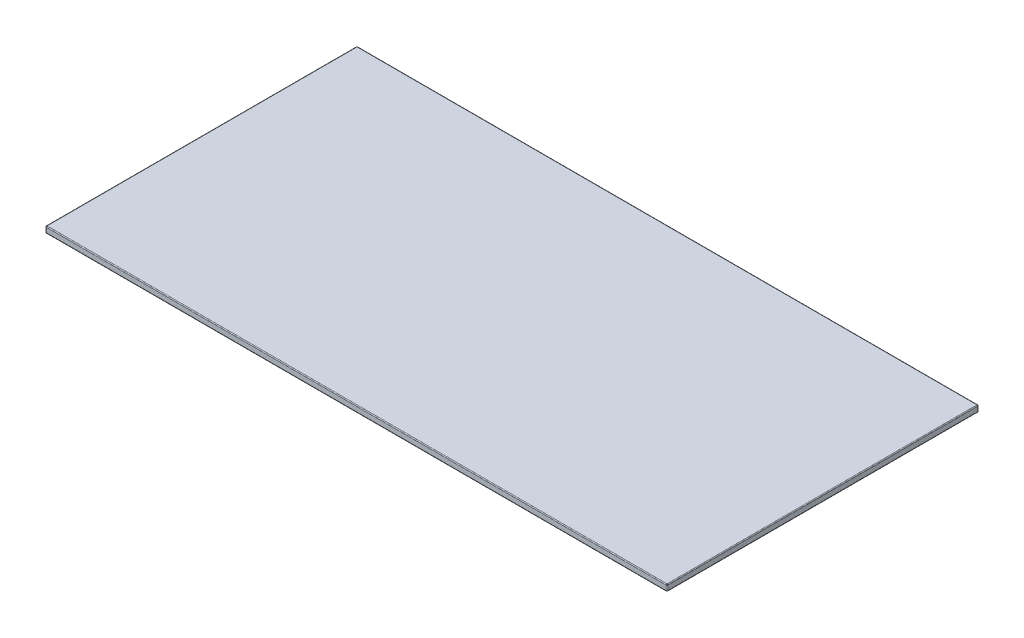
ISO-10303-21;
HEADER;
FILE_DESCRIPTION(('STEP AP214'),'2;1');
FILE_NAME('part.step','',(''),(''),'','','');
FILE_SCHEMA(('AUTOMOTIVE_DESIGN { 1 0 10303 214 1 1 1 1 }'));
ENDSEC;
DATA;
#1=APPLICATION_CONTEXT('core data for automotive mechanical design processes');
#2=APPLICATION_PROTOCOL_DEFINITION('international standard','automotive_design',2000,#1);
#3=PRODUCT_CONTEXT('',#1,'mechanical');
#4=PRODUCT('Part','Part','',(#3));
#5=PRODUCT_RELATED_PRODUCT_CATEGORY('part','',(#4));
#6=PRODUCT_DEFINITION_FORMATION('','',#4);
#7=PRODUCT_DEFINITION_CONTEXT('part definition',#1,'design');
#8=PRODUCT_DEFINITION('design','',#6,#7);
#9=PRODUCT_DEFINITION_SHAPE('','',#8);
#10=(LENGTH_UNIT() NAMED_UNIT(*) SI_UNIT(.MILLI.,.METRE.));
#11=(NAMED_UNIT(*) PLANE_ANGLE_UNIT() SI_UNIT($,.RADIAN.));
#12=(NAMED_UNIT(*) SI_UNIT($,.STERADIAN.) SOLID_ANGLE_UNIT());
#13=UNCERTAINTY_MEASURE_WITH_UNIT(LENGTH_MEASURE(1.E-05),#10,'distance_accuracy_value','');
#14=(GEOMETRIC_REPRESENTATION_CONTEXT(3) GLOBAL_UNCERTAINTY_ASSIGNED_CONTEXT((#13)) GLOBAL_UNIT_ASSIGNED_CONTEXT((#10,
#11,#12)) REPRESENTATION_CONTEXT('',''));
#15=CARTESIAN_POINT('',(0.,0.,0.));
#16=DIRECTION('',(0.,0.,1.));
#17=DIRECTION('',(1.,0.,0.));
#18=AXIS2_PLACEMENT_3D('',#15,#16,#17);
#19=CARTESIAN_POINT('',(-1018.38125,20.6375,510.38125));
#20=DIRECTION('',(1.,0.,0.));
#21=DIRECTION('',(0.,0.,-1.));
#22=AXIS2_PLACEMENT_3D('',#19,#20,#21);
#23=PLANE('',#22);
#24=DIRECTION('',(0.,0.,1.));
#25=VECTOR('',#24,1.);
#26=CARTESIAN_POINT('',(-1018.38125,2.54,510.38125));
#27=LINE('',#26,#25);
#28=CARTESIAN_POINT('',(-1018.38125,2.54,-507.84125));
#29=VERTEX_POINT('',#28);
#30=CARTESIAN_POINT('',(-1018.38125,2.54,507.84125));
#31=VERTEX_POINT('',#30);
#32=EDGE_CURVE('E194',#29,#31,#27,.T.);
#33=ORIENTED_EDGE('',*,*,#32,.T.);
#34=DIRECTION('',(0.,-1.,0.));
#35=VECTOR('',#34,1.);
#36=CARTESIAN_POINT('',(-1018.38125,20.6375,507.84125));
#37=LINE('',#36,#35);
#38=CARTESIAN_POINT('',(-1018.38125,18.0975,507.84125));
#39=VERTEX_POINT('',#38);
#40=EDGE_CURVE('E197',#31,#39,#37,.F.);
#41=ORIENTED_EDGE('',*,*,#40,.T.);
#42=DIRECTION('',(0.,0.,1.));
#43=VECTOR('',#42,1.);
#44=CARTESIAN_POINT('',(-1018.38125,18.0975,-510.38125));
#45=LINE('',#44,#43);
#46=CARTESIAN_POINT('',(-1018.38125,18.0975,-507.84125));
#47=VERTEX_POINT('',#46);
#48=EDGE_CURVE('E192',#39,#47,#45,.F.);
#49=ORIENTED_EDGE('',*,*,#48,.T.);
#50=DIRECTION('',(0.,-1.,0.));
#51=VECTOR('',#50,1.);
#52=CARTESIAN_POINT('',(-1018.38125,20.6375,-507.84125));
#53=LINE('',#52,#51);
#54=EDGE_CURVE('E190',#47,#29,#53,.T.);
#55=ORIENTED_EDGE('',*,*,#54,.T.);
#56=EDGE_LOOP('',(#33,#41,#49,#55));
#57=FACE_BOUND('',#56,.T.);
#58=ADVANCED_FACE('F35',(#57),#23,.F.);
#59=CARTESIAN_POINT('',(1018.38125,20.6375,510.38125));
#60=DIRECTION('',(0.,0.,-1.));
#61=DIRECTION('',(-1.,0.,0.));
#62=AXIS2_PLACEMENT_3D('',#59,#60,#61);
#63=PLANE('',#62);
#64=DIRECTION('',(1.,0.,0.));
#65=VECTOR('',#64,1.);
#66=CARTESIAN_POINT('',(1018.38125,2.54,510.38125));
#67=LINE('',#66,#65);
#68=CARTESIAN_POINT('',(-1015.84125,2.54,510.38125));
#69=VERTEX_POINT('',#68);
#70=CARTESIAN_POINT('',(1015.84125,2.54,510.38125));
#71=VERTEX_POINT('',#70);
#72=EDGE_CURVE('E134',#69,#71,#67,.T.);
#73=ORIENTED_EDGE('',*,*,#72,.T.);
#74=DIRECTION('',(0.,-1.,0.));
#75=VECTOR('',#74,1.);
#76=CARTESIAN_POINT('',(1015.84125,20.6375,510.38125));
#77=LINE('',#76,#75);
#78=CARTESIAN_POINT('',(1015.84125,18.0975,510.38125));
#79=VERTEX_POINT('',#78);
#80=EDGE_CURVE('E130',#71,#79,#77,.F.);
#81=ORIENTED_EDGE('',*,*,#80,.T.);
#82=DIRECTION('',(1.,0.,0.));
#83=VECTOR('',#82,1.);
#84=CARTESIAN_POINT('',(-1018.38125,18.0975,510.38125));
#85=LINE('',#84,#83);
#86=CARTESIAN_POINT('',(-1015.84125,18.0975,510.38125));
#87=VERTEX_POINT('',#86);
#88=EDGE_CURVE('E122',#79,#87,#85,.F.);
#89=ORIENTED_EDGE('',*,*,#88,.T.);
#90=DIRECTION('',(0.,-1.,0.));
#91=VECTOR('',#90,1.);
#92=CARTESIAN_POINT('',(-1015.84125,20.6375,510.38125));
#93=LINE('',#92,#91);
#94=EDGE_CURVE('E127',#87,#69,#93,.T.);
#95=ORIENTED_EDGE('',*,*,#94,.T.);
#96=EDGE_LOOP('',(#73,#81,#89,#95));
#97=FACE_BOUND('',#96,.T.);
#98=ADVANCED_FACE('F125',(#97),#63,.F.);
#99=CARTESIAN_POINT('',(1018.38125,20.6375,510.38125));
#100=DIRECTION('',(-1.,0.,0.));
#101=DIRECTION('',(0.,0.,1.));
#102=AXIS2_PLACEMENT_3D('',#99,#100,#101);
#103=PLANE('',#102);
#104=DIRECTION('',(0.,0.,-1.));
#105=VECTOR('',#104,1.);
#106=CARTESIAN_POINT('',(1018.38125,18.0975,510.38125));
#107=LINE('',#106,#105);
#108=CARTESIAN_POINT('',(1018.38125,18.0975,-507.84125));
#109=VERTEX_POINT('',#108);
#110=CARTESIAN_POINT('',(1018.38125,18.0975,507.84125));
#111=VERTEX_POINT('',#110);
#112=EDGE_CURVE('E174',#109,#111,#107,.F.);
#113=ORIENTED_EDGE('',*,*,#112,.T.);
#114=DIRECTION('',(0.,-1.,0.));
#115=VECTOR('',#114,1.);
#116=CARTESIAN_POINT('',(1018.38125,20.6375,507.84125));
#117=LINE('',#116,#115);
#118=CARTESIAN_POINT('',(1018.38125,2.54,507.84125));
#119=VERTEX_POINT('',#118);
#120=EDGE_CURVE('E179',#111,#119,#117,.T.);
#121=ORIENTED_EDGE('',*,*,#120,.T.);
#122=DIRECTION('',(0.,0.,-1.));
#123=VECTOR('',#122,1.);
#124=CARTESIAN_POINT('',(1018.38125,2.54,510.38125));
#125=LINE('',#124,#123);
#126=CARTESIAN_POINT('',(1018.38125,2.54,-507.84125));
#127=VERTEX_POINT('',#126);
#128=EDGE_CURVE('E176',#119,#127,#125,.T.);
#129=ORIENTED_EDGE('',*,*,#128,.T.);
#130=DIRECTION('',(0.,-1.,0.));
#131=VECTOR('',#130,1.);
#132=CARTESIAN_POINT('',(1018.38125,20.6375,-507.84125));
#133=LINE('',#132,#131);
#134=EDGE_CURVE('E172',#127,#109,#133,.F.);
#135=ORIENTED_EDGE('',*,*,#134,.T.);
#136=EDGE_LOOP('',(#113,#121,#129,#135));
#137=FACE_BOUND('',#136,.T.);
#138=ADVANCED_FACE('F265',(#137),#103,.F.);
#139=CARTESIAN_POINT('',(1018.38125,20.6375,-510.38125));
#140=DIRECTION('',(0.,0.,1.));
#141=DIRECTION('',(1.,0.,0.));
#142=AXIS2_PLACEMENT_3D('',#139,#140,#141);
#143=PLANE('',#142);
#144=DIRECTION('',(-1.,0.,0.));
#145=VECTOR('',#144,1.);
#146=CARTESIAN_POINT('',(1018.38125,18.0975,-510.38125));
#147=LINE('',#146,#145);
#148=CARTESIAN_POINT('',(-1015.84125,18.0975,-510.38125));
#149=VERTEX_POINT('',#148);
#150=CARTESIAN_POINT('',(1015.84125,18.0975,-510.38125));
#151=VERTEX_POINT('',#150);
#152=EDGE_CURVE('E183',#149,#151,#147,.F.);
#153=ORIENTED_EDGE('',*,*,#152,.T.);
#154=DIRECTION('',(0.,-1.,0.));
#155=VECTOR('',#154,1.);
#156=CARTESIAN_POINT('',(1015.84125,20.6375,-510.38125));
#157=LINE('',#156,#155);
#158=CARTESIAN_POINT('',(1015.84125,2.54,-510.38125));
#159=VERTEX_POINT('',#158);
#160=EDGE_CURVE('E188',#151,#159,#157,.T.);
#161=ORIENTED_EDGE('',*,*,#160,.T.);
#162=DIRECTION('',(-1.,0.,0.));
#163=VECTOR('',#162,1.);
#164=CARTESIAN_POINT('',(1018.38125,2.54,-510.38125));
#165=LINE('',#164,#163);
#166=CARTESIAN_POINT('',(-1015.84125,2.54,-510.38125));
#167=VERTEX_POINT('',#166);
#168=EDGE_CURVE('E185',#159,#167,#165,.T.);
#169=ORIENTED_EDGE('',*,*,#168,.T.);
#170=DIRECTION('',(0.,-1.,0.));
#171=VECTOR('',#170,1.);
#172=CARTESIAN_POINT('',(-1015.84125,20.6375,-510.38125));
#173=LINE('',#172,#171);
#174=EDGE_CURVE('E181',#167,#149,#173,.F.);
#175=ORIENTED_EDGE('',*,*,#174,.T.);
#176=EDGE_LOOP('',(#153,#161,#169,#175));
#177=FACE_BOUND('',#176,.T.);
#178=ADVANCED_FACE('F274',(#177),#143,.F.);
#179=CARTESIAN_POINT('',(0.,20.6375,0.));
#180=DIRECTION('',(0.,1.,0.));
#181=DIRECTION('',(0.,0.,1.));
#182=AXIS2_PLACEMENT_3D('',#179,#180,#181);
#183=PLANE('',#182);
#184=DIRECTION('',(0.,0.,-1.));
#185=VECTOR('',#184,1.);
#186=CARTESIAN_POINT('',(1015.84125,20.6375,-510.38125));
#187=LINE('',#186,#185);
#188=CARTESIAN_POINT('',(1015.84125,20.6375,507.84125));
#189=VERTEX_POINT('',#188);
#190=CARTESIAN_POINT('',(1015.84125,20.6375,-507.84125));
#191=VERTEX_POINT('',#190);
#192=EDGE_CURVE('E44',#189,#191,#187,.T.);
#193=ORIENTED_EDGE('',*,*,#192,.T.);
#194=DIRECTION('',(-1.,0.,0.));
#195=VECTOR('',#194,1.);
#196=CARTESIAN_POINT('',(-1018.38125,20.6375,-507.84125));
#197=LINE('',#196,#195);
#198=CARTESIAN_POINT('',(-1015.84125,20.6375,-507.84125));
#199=VERTEX_POINT('',#198);
#200=EDGE_CURVE('E11',#191,#199,#197,.T.);
#201=ORIENTED_EDGE('',*,*,#200,.T.);
#202=DIRECTION('',(0.,0.,1.));
#203=VECTOR('',#202,1.);
#204=CARTESIAN_POINT('',(-1015.84125,20.6375,510.38125));
#205=LINE('',#204,#203);
#206=CARTESIAN_POINT('',(-1015.84125,20.6375,507.84125));
#207=VERTEX_POINT('',#206);
#208=EDGE_CURVE('E199',#199,#207,#205,.T.);
#209=ORIENTED_EDGE('',*,*,#208,.T.);
#210=DIRECTION('',(1.,0.,0.));
#211=VECTOR('',#210,1.);
#212=CARTESIAN_POINT('',(1018.38125,20.6375,507.84125));
#213=LINE('',#212,#211);
#214=EDGE_CURVE('E55',#207,#189,#213,.T.);
#215=ORIENTED_EDGE('',*,*,#214,.T.);
#216=EDGE_LOOP('',(#193,#201,#209,#215));
#217=FACE_BOUND('',#216,.T.);
#218=ADVANCED_FACE('F296',(#217),#183,.T.);
#219=CARTESIAN_POINT('',(0.,0.,0.));
#220=DIRECTION('',(0.,1.,0.));
#221=DIRECTION('',(0.,0.,1.));
#222=AXIS2_PLACEMENT_3D('',#219,#220,#221);
#223=PLANE('',#222);
#224=DIRECTION('',(0.,0.,-1.));
#225=VECTOR('',#224,1.);
#226=CARTESIAN_POINT('',(1015.84125,0.,0.));
#227=LINE('',#226,#225);
#228=CARTESIAN_POINT('',(1015.84125,0.,-507.84125));
#229=VERTEX_POINT('',#228);
#230=CARTESIAN_POINT('',(1015.84125,0.,507.84125));
#231=VERTEX_POINT('',#230);
#232=EDGE_CURVE('E167',#229,#231,#227,.F.);
#233=ORIENTED_EDGE('',*,*,#232,.T.);
#234=DIRECTION('',(1.,0.,0.));
#235=VECTOR('',#234,1.);
#236=CARTESIAN_POINT('',(0.,0.,507.84125));
#237=LINE('',#236,#235);
#238=CARTESIAN_POINT('',(-1015.84125,0.,507.84125));
#239=VERTEX_POINT('',#238);
#240=EDGE_CURVE('E169',#231,#239,#237,.F.);
#241=ORIENTED_EDGE('',*,*,#240,.T.);
#242=DIRECTION('',(0.,0.,1.));
#243=VECTOR('',#242,1.);
#244=CARTESIAN_POINT('',(-1015.84125,0.,0.));
#245=LINE('',#244,#243);
#246=CARTESIAN_POINT('',(-1015.84125,0.,-507.84125));
#247=VERTEX_POINT('',#246);
#248=EDGE_CURVE('E163',#239,#247,#245,.F.);
#249=ORIENTED_EDGE('',*,*,#248,.T.);
#250=DIRECTION('',(-1.,0.,0.));
#251=VECTOR('',#250,1.);
#252=CARTESIAN_POINT('',(0.,0.,-507.84125));
#253=LINE('',#252,#251);
#254=EDGE_CURVE('E165',#247,#229,#253,.F.);
#255=ORIENTED_EDGE('',*,*,#254,.T.);
#256=EDGE_LOOP('',(#233,#241,#249,#255));
#257=FACE_BOUND('',#256,.T.);
#258=ADVANCED_FACE('F298',(#257),#223,.F.);
#259=CARTESIAN_POINT('',(0.,18.0975,-507.84125));
#260=DIRECTION('',(1.,0.,0.));
#261=DIRECTION('',(0.,0.,-1.));
#262=AXIS2_PLACEMENT_3D('',#259,#260,#261);
#263=CYLINDRICAL_SURFACE('',#262,2.54);
#264=CARTESIAN_POINT('',(-1015.84125,18.0975,-507.84125));
#265=DIRECTION('',(-1.,0.,0.));
#266=DIRECTION('',(0.,0.,1.));
#267=AXIS2_PLACEMENT_3D('',#264,#265,#266);
#268=CIRCLE('',#267,2.54);
#269=EDGE_CURVE('E39',#199,#149,#268,.T.);
#270=ORIENTED_EDGE('',*,*,#269,.F.);
#271=ORIENTED_EDGE('',*,*,#200,.F.);
#272=CARTESIAN_POINT('',(1015.84125,18.0975,-507.84125));
#273=DIRECTION('',(1.,0.,0.));
#274=DIRECTION('',(0.,0.,-1.));
#275=AXIS2_PLACEMENT_3D('',#272,#273,#274);
#276=CIRCLE('',#275,2.54);
#277=EDGE_CURVE('E159',#151,#191,#276,.T.);
#278=ORIENTED_EDGE('',*,*,#277,.F.);
#279=ORIENTED_EDGE('',*,*,#152,.F.);
#280=EDGE_LOOP('',(#270,#271,#278,#279));
#281=FACE_BOUND('',#280,.T.);
#282=ADVANCED_FACE('F37',(#281),#263,.T.);
#283=CARTESIAN_POINT('',(-1015.84125,18.0975,-507.84125));
#284=DIRECTION('',(0.,0.,1.));
#285=DIRECTION('',(1.,0.,0.));
#286=AXIS2_PLACEMENT_3D('',#283,#284,#285);
#287=SPHERICAL_SURFACE('',#286,2.54);
#288=CARTESIAN_POINT('',(-1015.84125,18.0975,-507.84125));
#289=DIRECTION('',(0.,0.,-1.));
#290=DIRECTION('',(-1.,0.,0.));
#291=AXIS2_PLACEMENT_3D('',#288,#289,#290);
#292=CIRCLE('',#291,2.54);
#293=EDGE_CURVE('E245',#199,#47,#292,.F.);
#294=ORIENTED_EDGE('',*,*,#293,.F.);
#295=ORIENTED_EDGE('',*,*,#269,.T.);
#296=CARTESIAN_POINT('',(-1015.84125,18.0975,-507.84125));
#297=DIRECTION('',(0.,1.,0.));
#298=DIRECTION('',(0.,0.,1.));
#299=AXIS2_PLACEMENT_3D('',#296,#297,#298);
#300=CIRCLE('',#299,2.54);
#301=EDGE_CURVE('E248',#47,#149,#300,.F.);
#302=ORIENTED_EDGE('',*,*,#301,.F.);
#303=EDGE_LOOP('',(#294,#295,#302));
#304=FACE_BOUND('',#303,.T.);
#305=ADVANCED_FACE('F292',(#304),#287,.T.);
#306=CARTESIAN_POINT('',(1015.84125,18.0975,-507.84125));
#307=DIRECTION('',(0.,0.,1.));
#308=DIRECTION('',(1.,0.,0.));
#309=AXIS2_PLACEMENT_3D('',#306,#307,#308);
#310=SPHERICAL_SURFACE('',#309,2.54);
#311=CARTESIAN_POINT('',(1015.84125,18.0975,-507.84125));
#312=DIRECTION('',(0.,1.,0.));
#313=DIRECTION('',(0.,0.,1.));
#314=AXIS2_PLACEMENT_3D('',#311,#312,#313);
#315=CIRCLE('',#314,2.54);
#316=EDGE_CURVE('E239',#151,#109,#315,.F.);
#317=ORIENTED_EDGE('',*,*,#316,.F.);
#318=ORIENTED_EDGE('',*,*,#277,.T.);
#319=CARTESIAN_POINT('',(1015.84125,18.0975,-507.84125));
#320=DIRECTION('',(0.,0.,-1.));
#321=DIRECTION('',(-1.,0.,0.));
#322=AXIS2_PLACEMENT_3D('',#319,#320,#321);
#323=CIRCLE('',#322,2.54);
#324=EDGE_CURVE('E242',#109,#191,#323,.F.);
#325=ORIENTED_EDGE('',*,*,#324,.F.);
#326=EDGE_LOOP('',(#317,#318,#325));
#327=FACE_BOUND('',#326,.T.);
#328=ADVANCED_FACE('F255',(#327),#310,.T.);
#329=CARTESIAN_POINT('',(-1015.84125,20.6375,-507.84125));
#330=DIRECTION('',(0.,-1.,0.));
#331=DIRECTION('',(0.,0.,-1.));
#332=AXIS2_PLACEMENT_3D('',#329,#330,#331);
#333=CYLINDRICAL_SURFACE('',#332,2.54);
#334=ORIENTED_EDGE('',*,*,#301,.T.);
#335=ORIENTED_EDGE('',*,*,#174,.F.);
#336=CARTESIAN_POINT('',(-1015.84125,2.54,-507.84125));
#337=DIRECTION('',(0.,-1.,0.));
#338=DIRECTION('',(0.,0.,-1.));
#339=AXIS2_PLACEMENT_3D('',#336,#337,#338);
#340=CIRCLE('',#339,2.54);
#341=EDGE_CURVE('E234',#29,#167,#340,.T.);
#342=ORIENTED_EDGE('',*,*,#341,.F.);
#343=ORIENTED_EDGE('',*,*,#54,.F.);
#344=EDGE_LOOP('',(#334,#335,#342,#343));
#345=FACE_BOUND('',#344,.T.);
#346=ADVANCED_FACE('F286',(#345),#333,.T.);
#347=CARTESIAN_POINT('',(-1015.84125,18.0975,0.));
#348=DIRECTION('',(0.,0.,-1.));
#349=DIRECTION('',(-1.,0.,0.));
#350=AXIS2_PLACEMENT_3D('',#347,#348,#349);
#351=CYLINDRICAL_SURFACE('',#350,2.54);
#352=ORIENTED_EDGE('',*,*,#293,.T.);
#353=ORIENTED_EDGE('',*,*,#48,.F.);
#354=CARTESIAN_POINT('',(-1015.84125,18.0975,507.84125));
#355=DIRECTION('',(0.,0.,1.));
#356=DIRECTION('',(1.,0.,0.));
#357=AXIS2_PLACEMENT_3D('',#354,#355,#356);
#358=CIRCLE('',#357,2.54);
#359=EDGE_CURVE('E143',#207,#39,#358,.T.);
#360=ORIENTED_EDGE('',*,*,#359,.F.);
#361=ORIENTED_EDGE('',*,*,#208,.F.);
#362=EDGE_LOOP('',(#352,#353,#360,#361));
#363=FACE_BOUND('',#362,.T.);
#364=ADVANCED_FACE('F295',(#363),#351,.T.);
#365=CARTESIAN_POINT('',(0.,18.0975,507.84125));
#366=DIRECTION('',(-1.,0.,0.));
#367=DIRECTION('',(0.,0.,1.));
#368=AXIS2_PLACEMENT_3D('',#365,#366,#367);
#369=CYLINDRICAL_SURFACE('',#368,2.54);
#370=CARTESIAN_POINT('',(1015.84125,18.0975,507.84125));
#371=DIRECTION('',(1.,0.,0.));
#372=DIRECTION('',(0.,0.,-1.));
#373=AXIS2_PLACEMENT_3D('',#370,#371,#372);
#374=CIRCLE('',#373,2.54);
#375=EDGE_CURVE('E144',#189,#79,#374,.T.);
#376=ORIENTED_EDGE('',*,*,#375,.F.);
#377=ORIENTED_EDGE('',*,*,#214,.F.);
#378=CARTESIAN_POINT('',(-1015.84125,18.0975,507.84125));
#379=DIRECTION('',(-1.,0.,0.));
#380=DIRECTION('',(0.,-1.,0.));
#381=AXIS2_PLACEMENT_3D('',#378,#379,#380);
#382=CIRCLE('',#381,2.54);
#383=EDGE_CURVE('E137',#87,#207,#382,.T.);
#384=ORIENTED_EDGE('',*,*,#383,.F.);
#385=ORIENTED_EDGE('',*,*,#88,.F.);
#386=EDGE_LOOP('',(#376,#377,#384,#385));
#387=FACE_BOUND('',#386,.T.);
#388=ADVANCED_FACE('F139',(#387),#369,.T.);
#389=CARTESIAN_POINT('',(1015.84125,18.0975,0.));
#390=DIRECTION('',(0.,0.,1.));
#391=DIRECTION('',(1.,0.,0.));
#392=AXIS2_PLACEMENT_3D('',#389,#390,#391);
#393=CYLINDRICAL_SURFACE('',#392,2.54);
#394=ORIENTED_EDGE('',*,*,#324,.T.);
#395=ORIENTED_EDGE('',*,*,#192,.F.);
#396=CARTESIAN_POINT('',(1015.84125,18.0975,507.84125));
#397=DIRECTION('',(0.,0.,1.));
#398=DIRECTION('',(1.,0.,0.));
#399=AXIS2_PLACEMENT_3D('',#396,#397,#398);
#400=CIRCLE('',#399,2.54);
#401=EDGE_CURVE('E229',#111,#189,#400,.T.);
#402=ORIENTED_EDGE('',*,*,#401,.F.);
#403=ORIENTED_EDGE('',*,*,#112,.F.);
#404=EDGE_LOOP('',(#394,#395,#402,#403));
#405=FACE_BOUND('',#404,.T.);
#406=ADVANCED_FACE('F261',(#405),#393,.T.);
#407=CARTESIAN_POINT('',(1015.84125,20.6375,-507.84125));
#408=DIRECTION('',(0.,-1.,0.));
#409=DIRECTION('',(0.,0.,-1.));
#410=AXIS2_PLACEMENT_3D('',#407,#408,#409);
#411=CYLINDRICAL_SURFACE('',#410,2.54);
#412=ORIENTED_EDGE('',*,*,#316,.T.);
#413=ORIENTED_EDGE('',*,*,#134,.F.);
#414=CARTESIAN_POINT('',(1015.84125,2.54,-507.84125));
#415=DIRECTION('',(0.,-1.,0.));
#416=DIRECTION('',(0.,0.,-1.));
#417=AXIS2_PLACEMENT_3D('',#414,#415,#416);
#418=CIRCLE('',#417,2.54);
#419=EDGE_CURVE('E226',#159,#127,#418,.T.);
#420=ORIENTED_EDGE('',*,*,#419,.F.);
#421=ORIENTED_EDGE('',*,*,#160,.F.);
#422=EDGE_LOOP('',(#412,#413,#420,#421));
#423=FACE_BOUND('',#422,.T.);
#424=ADVANCED_FACE('F271',(#423),#411,.T.);
#425=CARTESIAN_POINT('',(1018.38125,2.54,-507.84125));
#426=DIRECTION('',(-1.,0.,0.));
#427=DIRECTION('',(0.,0.,1.));
#428=AXIS2_PLACEMENT_3D('',#425,#426,#427);
#429=CYLINDRICAL_SURFACE('',#428,2.54);
#430=CARTESIAN_POINT('',(-1015.84125,2.54,-507.84125));
#431=DIRECTION('',(-1.,0.,0.));
#432=DIRECTION('',(0.,0.,1.));
#433=AXIS2_PLACEMENT_3D('',#430,#431,#432);
#434=CIRCLE('',#433,2.54);
#435=EDGE_CURVE('E236',#167,#247,#434,.T.);
#436=ORIENTED_EDGE('',*,*,#435,.F.);
#437=ORIENTED_EDGE('',*,*,#168,.F.);
#438=CARTESIAN_POINT('',(1015.84125,2.54,-507.84125));
#439=DIRECTION('',(1.,0.,0.));
#440=DIRECTION('',(0.,0.,-1.));
#441=AXIS2_PLACEMENT_3D('',#438,#439,#440);
#442=CIRCLE('',#441,2.54);
#443=EDGE_CURVE('E223',#229,#159,#442,.T.);
#444=ORIENTED_EDGE('',*,*,#443,.F.);
#445=ORIENTED_EDGE('',*,*,#254,.F.);
#446=EDGE_LOOP('',(#436,#437,#444,#445));
#447=FACE_BOUND('',#446,.T.);
#448=ADVANCED_FACE('F278',(#447),#429,.T.);
#449=CARTESIAN_POINT('',(-1015.84125,2.54,-507.84125));
#450=DIRECTION('',(0.,0.,1.));
#451=DIRECTION('',(1.,0.,0.));
#452=AXIS2_PLACEMENT_3D('',#449,#450,#451);
#453=SPHERICAL_SURFACE('',#452,2.54);
#454=ORIENTED_EDGE('',*,*,#341,.T.);
#455=ORIENTED_EDGE('',*,*,#435,.T.);
#456=CARTESIAN_POINT('',(-1015.84125,2.54,-507.84125));
#457=DIRECTION('',(0.,0.,-1.));
#458=DIRECTION('',(-1.,0.,0.));
#459=AXIS2_PLACEMENT_3D('',#456,#457,#458);
#460=CIRCLE('',#459,2.54);
#461=EDGE_CURVE('E151',#29,#247,#460,.F.);
#462=ORIENTED_EDGE('',*,*,#461,.F.);
#463=EDGE_LOOP('',(#454,#455,#462));
#464=FACE_BOUND('',#463,.T.);
#465=ADVANCED_FACE('F352',(#464),#453,.T.);
#466=CARTESIAN_POINT('',(-1015.84125,18.0975,507.84125));
#467=DIRECTION('',(0.,0.,1.));
#468=DIRECTION('',(1.,0.,0.));
#469=AXIS2_PLACEMENT_3D('',#466,#467,#468);
#470=SPHERICAL_SURFACE('',#469,2.54);
#471=ORIENTED_EDGE('',*,*,#383,.T.);
#472=ORIENTED_EDGE('',*,*,#359,.T.);
#473=CARTESIAN_POINT('',(-1015.84125,18.0975,507.84125));
#474=DIRECTION('',(0.,1.,0.));
#475=DIRECTION('',(0.,0.,1.));
#476=AXIS2_PLACEMENT_3D('',#473,#474,#475);
#477=CIRCLE('',#476,2.54);
#478=EDGE_CURVE('E147',#87,#39,#477,.F.);
#479=ORIENTED_EDGE('',*,*,#478,.F.);
#480=EDGE_LOOP('',(#471,#472,#479));
#481=FACE_BOUND('',#480,.T.);
#482=ADVANCED_FACE('F148',(#481),#470,.T.);
#483=CARTESIAN_POINT('',(1015.84125,18.0975,507.84125));
#484=DIRECTION('',(0.,0.,1.));
#485=DIRECTION('',(1.,0.,0.));
#486=AXIS2_PLACEMENT_3D('',#483,#484,#485);
#487=SPHERICAL_SURFACE('',#486,2.54);
#488=ORIENTED_EDGE('',*,*,#401,.T.);
#489=ORIENTED_EDGE('',*,*,#375,.T.);
#490=CARTESIAN_POINT('',(1015.84125,18.0975,507.84125));
#491=DIRECTION('',(0.,1.,0.));
#492=DIRECTION('',(0.,0.,1.));
#493=AXIS2_PLACEMENT_3D('',#490,#491,#492);
#494=CIRCLE('',#493,2.54);
#495=EDGE_CURVE('E152',#111,#79,#494,.F.);
#496=ORIENTED_EDGE('',*,*,#495,.F.);
#497=EDGE_LOOP('',(#488,#489,#496));
#498=FACE_BOUND('',#497,.T.);
#499=ADVANCED_FACE('F345',(#498),#487,.T.);
#500=CARTESIAN_POINT('',(1015.84125,2.54,-507.84125));
#501=DIRECTION('',(0.,0.,1.));
#502=DIRECTION('',(1.,0.,0.));
#503=AXIS2_PLACEMENT_3D('',#500,#501,#502);
#504=SPHERICAL_SURFACE('',#503,2.54);
#505=ORIENTED_EDGE('',*,*,#443,.T.);
#506=ORIENTED_EDGE('',*,*,#419,.T.);
#507=CARTESIAN_POINT('',(1015.84125,2.54,-507.84125));
#508=DIRECTION('',(0.,0.,-1.));
#509=DIRECTION('',(-1.,0.,0.));
#510=AXIS2_PLACEMENT_3D('',#507,#508,#509);
#511=CIRCLE('',#510,2.54);
#512=EDGE_CURVE('E217',#229,#127,#511,.F.);
#513=ORIENTED_EDGE('',*,*,#512,.F.);
#514=EDGE_LOOP('',(#505,#506,#513));
#515=FACE_BOUND('',#514,.T.);
#516=ADVANCED_FACE('F341',(#515),#504,.T.);
#517=CARTESIAN_POINT('',(-1015.84125,2.54,510.38125));
#518=DIRECTION('',(0.,0.,1.));
#519=DIRECTION('',(1.,0.,0.));
#520=AXIS2_PLACEMENT_3D('',#517,#518,#519);
#521=CYLINDRICAL_SURFACE('',#520,2.54);
#522=ORIENTED_EDGE('',*,*,#461,.T.);
#523=ORIENTED_EDGE('',*,*,#248,.F.);
#524=CARTESIAN_POINT('',(-1015.84125,2.54,507.84125));
#525=DIRECTION('',(0.,0.,1.));
#526=DIRECTION('',(1.,0.,0.));
#527=AXIS2_PLACEMENT_3D('',#524,#525,#526);
#528=CIRCLE('',#527,2.54);
#529=EDGE_CURVE('E214',#31,#239,#528,.T.);
#530=ORIENTED_EDGE('',*,*,#529,.F.);
#531=ORIENTED_EDGE('',*,*,#32,.F.);
#532=EDGE_LOOP('',(#522,#523,#530,#531));
#533=FACE_BOUND('',#532,.T.);
#534=ADVANCED_FACE('F338',(#533),#521,.T.);
#535=CARTESIAN_POINT('',(-1015.84125,20.6375,507.84125));
#536=DIRECTION('',(0.,-1.,0.));
#537=DIRECTION('',(0.,0.,-1.));
#538=AXIS2_PLACEMENT_3D('',#535,#536,#537);
#539=CYLINDRICAL_SURFACE('',#538,2.54);
#540=ORIENTED_EDGE('',*,*,#478,.T.);
#541=ORIENTED_EDGE('',*,*,#40,.F.);
#542=CARTESIAN_POINT('',(-1015.84125,2.54,507.84125));
#543=DIRECTION('',(0.,-1.,0.));
#544=DIRECTION('',(0.,0.,-1.));
#545=AXIS2_PLACEMENT_3D('',#542,#543,#544);
#546=CIRCLE('',#545,2.54);
#547=EDGE_CURVE('E155',#69,#31,#546,.T.);
#548=ORIENTED_EDGE('',*,*,#547,.F.);
#549=ORIENTED_EDGE('',*,*,#94,.F.);
#550=EDGE_LOOP('',(#540,#541,#548,#549));
#551=FACE_BOUND('',#550,.T.);
#552=ADVANCED_FACE('F154',(#551),#539,.T.);
#553=CARTESIAN_POINT('',(1015.84125,20.6375,507.84125));
#554=DIRECTION('',(0.,-1.,0.));
#555=DIRECTION('',(0.,0.,-1.));
#556=AXIS2_PLACEMENT_3D('',#553,#554,#555);
#557=CYLINDRICAL_SURFACE('',#556,2.54);
#558=ORIENTED_EDGE('',*,*,#495,.T.);
#559=ORIENTED_EDGE('',*,*,#80,.F.);
#560=CARTESIAN_POINT('',(1015.84125,2.54,507.84125));
#561=DIRECTION('',(0.,-1.,0.));
#562=DIRECTION('',(0.,0.,-1.));
#563=AXIS2_PLACEMENT_3D('',#560,#561,#562);
#564=CIRCLE('',#563,2.54);
#565=EDGE_CURVE('E210',#119,#71,#564,.T.);
#566=ORIENTED_EDGE('',*,*,#565,.F.);
#567=ORIENTED_EDGE('',*,*,#120,.F.);
#568=EDGE_LOOP('',(#558,#559,#566,#567));
#569=FACE_BOUND('',#568,.T.);
#570=ADVANCED_FACE('F331',(#569),#557,.T.);
#571=CARTESIAN_POINT('',(1015.84125,2.54,510.38125));
#572=DIRECTION('',(0.,0.,-1.));
#573=DIRECTION('',(-1.,0.,0.));
#574=AXIS2_PLACEMENT_3D('',#571,#572,#573);
#575=CYLINDRICAL_SURFACE('',#574,2.54);
#576=ORIENTED_EDGE('',*,*,#512,.T.);
#577=ORIENTED_EDGE('',*,*,#128,.F.);
#578=CARTESIAN_POINT('',(1015.84125,2.54,507.84125));
#579=DIRECTION('',(0.,0.,1.));
#580=DIRECTION('',(1.,0.,0.));
#581=AXIS2_PLACEMENT_3D('',#578,#579,#580);
#582=CIRCLE('',#581,2.54);
#583=EDGE_CURVE('E207',#231,#119,#582,.T.);
#584=ORIENTED_EDGE('',*,*,#583,.F.);
#585=ORIENTED_EDGE('',*,*,#232,.F.);
#586=EDGE_LOOP('',(#576,#577,#584,#585));
#587=FACE_BOUND('',#586,.T.);
#588=ADVANCED_FACE('F327',(#587),#575,.T.);
#589=CARTESIAN_POINT('',(-1015.84125,2.54,507.84125));
#590=DIRECTION('',(0.,0.,1.));
#591=DIRECTION('',(1.,0.,0.));
#592=AXIS2_PLACEMENT_3D('',#589,#590,#591);
#593=SPHERICAL_SURFACE('',#592,2.54);
#594=ORIENTED_EDGE('',*,*,#547,.T.);
#595=ORIENTED_EDGE('',*,*,#529,.T.);
#596=CARTESIAN_POINT('',(-1015.84125,2.54,507.84125));
#597=DIRECTION('',(-1.,0.,0.));
#598=DIRECTION('',(0.,0.,1.));
#599=AXIS2_PLACEMENT_3D('',#596,#597,#598);
#600=CIRCLE('',#599,2.54);
#601=EDGE_CURVE('E205',#69,#239,#600,.F.);
#602=ORIENTED_EDGE('',*,*,#601,.F.);
#603=EDGE_LOOP('',(#594,#595,#602));
#604=FACE_BOUND('',#603,.T.);
#605=ADVANCED_FACE('F323',(#604),#593,.T.);
#606=CARTESIAN_POINT('',(1015.84125,2.54,507.84125));
#607=DIRECTION('',(0.,0.,1.));
#608=DIRECTION('',(1.,0.,0.));
#609=AXIS2_PLACEMENT_3D('',#606,#607,#608);
#610=SPHERICAL_SURFACE('',#609,2.54);
#611=ORIENTED_EDGE('',*,*,#583,.T.);
#612=ORIENTED_EDGE('',*,*,#565,.T.);
#613=CARTESIAN_POINT('',(1015.84125,2.54,507.84125));
#614=DIRECTION('',(1.,0.,0.));
#615=DIRECTION('',(0.,0.,-1.));
#616=AXIS2_PLACEMENT_3D('',#613,#614,#615);
#617=CIRCLE('',#616,2.54);
#618=EDGE_CURVE('E203',#231,#71,#617,.F.);
#619=ORIENTED_EDGE('',*,*,#618,.F.);
#620=EDGE_LOOP('',(#611,#612,#619));
#621=FACE_BOUND('',#620,.T.);
#622=ADVANCED_FACE('F319',(#621),#610,.T.);
#623=CARTESIAN_POINT('',(1018.38125,2.54,507.84125));
#624=DIRECTION('',(1.,0.,0.));
#625=DIRECTION('',(0.,0.,-1.));
#626=AXIS2_PLACEMENT_3D('',#623,#624,#625);
#627=CYLINDRICAL_SURFACE('',#626,2.54);
#628=ORIENTED_EDGE('',*,*,#601,.T.);
#629=ORIENTED_EDGE('',*,*,#240,.F.);
#630=ORIENTED_EDGE('',*,*,#618,.T.);
#631=ORIENTED_EDGE('',*,*,#72,.F.);
#632=EDGE_LOOP('',(#628,#629,#630,#631));
#633=FACE_BOUND('',#632,.T.);
#634=ADVANCED_FACE('F316',(#633),#627,.T.);
#635=CLOSED_SHELL('',(#58,#98,#138,#178,#218,#258,#282,#305,#328,#346,#364,#388,#406,#424,#448,
#465,#482,#499,#516,#534,#552,#570,#588,#605,#622,#634));
#636=MANIFOLD_SOLID_BREP('B2',#635);
#637=ADVANCED_BREP_SHAPE_REPRESENTATION('',(#18,#636),#14);
#638=SHAPE_DEFINITION_REPRESENTATION(#9,#637);
ENDSEC;
END-ISO-10303-21;
